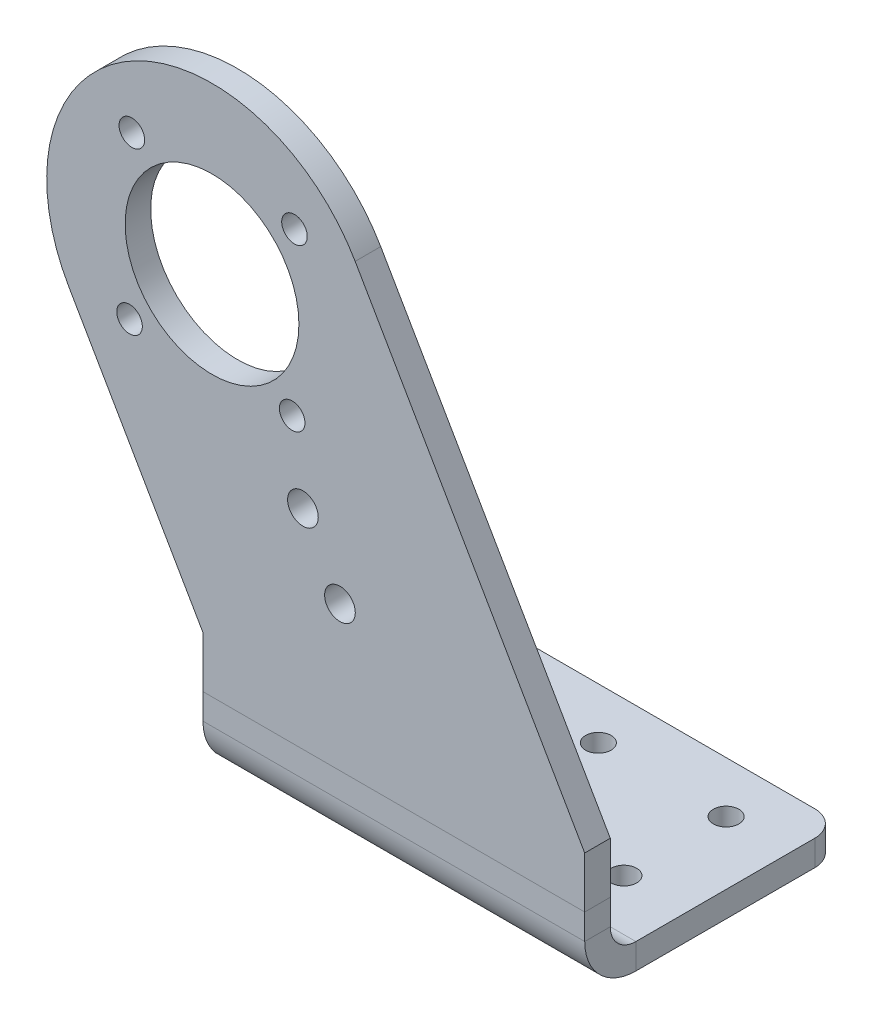
ISO-10303-21;
HEADER;
FILE_DESCRIPTION(('STEP AP214'),'2;1');
FILE_NAME('part.step','',(''),(''),'','','');
FILE_SCHEMA(('AUTOMOTIVE_DESIGN { 1 0 10303 214 1 1 1 1 }'));
ENDSEC;
DATA;
#1=APPLICATION_CONTEXT('core data for automotive mechanical design processes');
#2=APPLICATION_PROTOCOL_DEFINITION('international standard','automotive_design',2000,#1);
#3=PRODUCT_CONTEXT('',#1,'mechanical');
#4=PRODUCT('Part','Part','',(#3));
#5=PRODUCT_RELATED_PRODUCT_CATEGORY('part','',(#4));
#6=PRODUCT_DEFINITION_FORMATION('','',#4);
#7=PRODUCT_DEFINITION_CONTEXT('part definition',#1,'design');
#8=PRODUCT_DEFINITION('design','',#6,#7);
#9=PRODUCT_DEFINITION_SHAPE('','',#8);
#10=(LENGTH_UNIT() NAMED_UNIT(*) SI_UNIT(.MILLI.,.METRE.));
#11=(NAMED_UNIT(*) PLANE_ANGLE_UNIT() SI_UNIT($,.RADIAN.));
#12=(NAMED_UNIT(*) SI_UNIT($,.STERADIAN.) SOLID_ANGLE_UNIT());
#13=UNCERTAINTY_MEASURE_WITH_UNIT(LENGTH_MEASURE(1.E-05),#10,'distance_accuracy_value','');
#14=(GEOMETRIC_REPRESENTATION_CONTEXT(3) GLOBAL_UNCERTAINTY_ASSIGNED_CONTEXT((#13)) GLOBAL_UNIT_ASSIGNED_CONTEXT((#10,
#11,#12)) REPRESENTATION_CONTEXT('',''));
#15=CARTESIAN_POINT('',(0.,0.,0.));
#16=DIRECTION('',(0.,0.,1.));
#17=DIRECTION('',(1.,0.,0.));
#18=AXIS2_PLACEMENT_3D('',#15,#16,#17);
#19=CARTESIAN_POINT('',(51.5597538847893,-65.6863227653069,-5.));
#20=DIRECTION('',(1.,0.,0.));
#21=DIRECTION('',(0.,1.,0.));
#22=AXIS2_PLACEMENT_3D('',#19,#20,#21);
#23=PLANE('',#22);
#24=DIRECTION('',(0.,-1.,0.));
#25=VECTOR('',#24,1.);
#26=CARTESIAN_POINT('',(51.5597538847893,-65.6863227653069,-5.));
#27=LINE('',#26,#25);
#28=CARTESIAN_POINT('',(51.5597538847893,-65.6863227653069,-5.));
#29=VERTEX_POINT('',#28);
#30=CARTESIAN_POINT('',(51.5597538847893,-70.6863227653069,-5.));
#31=VERTEX_POINT('',#30);
#32=EDGE_CURVE('E180',#29,#31,#27,.T.);
#33=ORIENTED_EDGE('',*,*,#32,.F.);
#34=CARTESIAN_POINT('',(51.5597538847893,-60.6863227653069,-5.));
#35=DIRECTION('',(1.,0.,0.));
#36=DIRECTION('',(0.,1.,0.));
#37=AXIS2_PLACEMENT_3D('',#34,#35,#36);
#38=CIRCLE('',#37,5.);
#39=CARTESIAN_POINT('',(51.5597538847893,-60.6863227653069,0.));
#40=VERTEX_POINT('',#39);
#41=EDGE_CURVE('E214',#40,#29,#38,.T.);
#42=ORIENTED_EDGE('',*,*,#41,.F.);
#43=DIRECTION('',(0.,0.,-1.));
#44=VECTOR('',#43,1.);
#45=CARTESIAN_POINT('',(51.5597538847893,-60.6863227653069,5.));
#46=LINE('',#45,#44);
#47=CARTESIAN_POINT('',(51.5597538847893,-60.6863227653069,5.));
#48=VERTEX_POINT('',#47);
#49=EDGE_CURVE('E178',#48,#40,#46,.T.);
#50=ORIENTED_EDGE('',*,*,#49,.F.);
#51=CARTESIAN_POINT('',(51.5597538847893,-60.6863227653069,-5.));
#52=DIRECTION('',(1.,0.,0.));
#53=DIRECTION('',(0.,0.,-1.));
#54=AXIS2_PLACEMENT_3D('',#51,#52,#53);
#55=CIRCLE('',#54,10.);
#56=EDGE_CURVE('E177',#48,#31,#55,.T.);
#57=ORIENTED_EDGE('',*,*,#56,.T.);
#58=EDGE_LOOP('',(#33,#42,#50,#57));
#59=FACE_BOUND('',#58,.T.);
#60=ADVANCED_FACE('F49',(#59),#23,.T.);
#61=CARTESIAN_POINT('',(51.5597538847893,-60.6863227653069,5.));
#62=DIRECTION('',(1.,0.,0.));
#63=DIRECTION('',(0.,1.,0.));
#64=AXIS2_PLACEMENT_3D('',#61,#62,#63);
#65=PLANE('',#64);
#66=DIRECTION('',(0.,0.,-1.));
#67=VECTOR('',#66,1.);
#68=CARTESIAN_POINT('',(51.5597538847893,-70.6863227653069,-5.));
#69=LINE('',#68,#67);
#70=CARTESIAN_POINT('',(51.5597538847893,-70.6863227653069,-40.));
#71=VERTEX_POINT('',#70);
#72=EDGE_CURVE('E208',#31,#71,#69,.T.);
#73=ORIENTED_EDGE('',*,*,#72,.T.);
#74=DIRECTION('',(0.,-1.,0.));
#75=VECTOR('',#74,1.);
#76=CARTESIAN_POINT('',(51.5597538847893,-65.6863227653069,-40.));
#77=LINE('',#76,#75);
#78=CARTESIAN_POINT('',(51.5597538847893,-65.6863227653069,-40.));
#79=VERTEX_POINT('',#78);
#80=EDGE_CURVE('E72',#71,#79,#77,.F.);
#81=ORIENTED_EDGE('',*,*,#80,.T.);
#82=DIRECTION('',(0.,0.,-1.));
#83=VECTOR('',#82,1.);
#84=CARTESIAN_POINT('',(51.5597538847893,-65.6863227653069,-5.));
#85=LINE('',#84,#83);
#86=EDGE_CURVE('E196',#29,#79,#85,.T.);
#87=ORIENTED_EDGE('',*,*,#86,.F.);
#88=ORIENTED_EDGE('',*,*,#32,.T.);
#89=EDGE_LOOP('',(#73,#81,#87,#88));
#90=FACE_BOUND('',#89,.T.);
#91=ADVANCED_FACE('F210',(#90),#65,.T.);
#92=CARTESIAN_POINT('',(-75.3237340684686,-70.686322765307,-5.));
#93=DIRECTION('',(0.,-1.,0.));
#94=DIRECTION('',(1.,0.,0.));
#95=AXIS2_PLACEMENT_3D('',#92,#93,#94);
#96=PLANE('',#95);
#97=CARTESIAN_POINT('',(-10.7812238195632,-70.686322765307,-35.));
#98=DIRECTION('',(0.,1.,0.));
#99=DIRECTION('',(-1.,0.,0.));
#100=AXIS2_PLACEMENT_3D('',#97,#98,#99);
#101=CIRCLE('',#100,2.5);
#102=CARTESIAN_POINT('',(-13.2812238195632,-70.686322765307,-35.));
#103=VERTEX_POINT('',#102);
#104=EDGE_CURVE('E257',#103,#103,#101,.T.);
#105=ORIENTED_EDGE('',*,*,#104,.T.);
#106=EDGE_LOOP('',(#105));
#107=FACE_BOUND('',#106,.T.);
#108=CARTESIAN_POINT('',(-10.7812238195632,-70.686322765307,-15.));
#109=DIRECTION('',(0.,1.,0.));
#110=DIRECTION('',(-1.,0.,0.));
#111=AXIS2_PLACEMENT_3D('',#108,#109,#110);
#112=CIRCLE('',#111,2.5);
#113=CARTESIAN_POINT('',(-13.2812238195632,-70.686322765307,-15.));
#114=VERTEX_POINT('',#113);
#115=EDGE_CURVE('E276',#114,#114,#112,.T.);
#116=ORIENTED_EDGE('',*,*,#115,.T.);
#117=EDGE_LOOP('',(#116));
#118=FACE_BOUND('',#117,.T.);
#119=CARTESIAN_POINT('',(14.2187761804368,-70.686322765307,-15.));
#120=DIRECTION('',(0.,1.,0.));
#121=DIRECTION('',(-1.,0.,0.));
#122=AXIS2_PLACEMENT_3D('',#119,#120,#121);
#123=CIRCLE('',#122,2.5);
#124=CARTESIAN_POINT('',(11.7187761804368,-70.686322765307,-15.));
#125=VERTEX_POINT('',#124);
#126=EDGE_CURVE('E270',#125,#125,#123,.T.);
#127=ORIENTED_EDGE('',*,*,#126,.T.);
#128=EDGE_LOOP('',(#127));
#129=FACE_BOUND('',#128,.T.);
#130=CARTESIAN_POINT('',(39.2187761804368,-70.6863227653069,-15.));
#131=DIRECTION('',(0.,1.,0.));
#132=DIRECTION('',(1.,0.,0.));
#133=AXIS2_PLACEMENT_3D('',#130,#131,#132);
#134=CIRCLE('',#133,2.5);
#135=CARTESIAN_POINT('',(41.7187761804368,-70.6863227653069,-15.));
#136=VERTEX_POINT('',#135);
#137=EDGE_CURVE('E263',#136,#136,#134,.T.);
#138=ORIENTED_EDGE('',*,*,#137,.T.);
#139=EDGE_LOOP('',(#138));
#140=FACE_BOUND('',#139,.T.);
#141=CARTESIAN_POINT('',(39.2187761804368,-70.6863227653069,-35.));
#142=DIRECTION('',(0.,1.,0.));
#143=DIRECTION('',(1.,0.,0.));
#144=AXIS2_PLACEMENT_3D('',#141,#142,#143);
#145=CIRCLE('',#144,2.5);
#146=CARTESIAN_POINT('',(41.7187761804368,-70.6863227653069,-35.));
#147=VERTEX_POINT('',#146);
#148=EDGE_CURVE('E264',#147,#147,#145,.T.);
#149=ORIENTED_EDGE('',*,*,#148,.T.);
#150=EDGE_LOOP('',(#149));
#151=FACE_BOUND('',#150,.T.);
#152=CARTESIAN_POINT('',(14.2187761804368,-70.686322765307,-35.));
#153=DIRECTION('',(0.,1.,0.));
#154=DIRECTION('',(-1.,0.,0.));
#155=AXIS2_PLACEMENT_3D('',#152,#153,#154);
#156=CIRCLE('',#155,2.5);
#157=CARTESIAN_POINT('',(11.7187761804368,-70.686322765307,-35.));
#158=VERTEX_POINT('',#157);
#159=EDGE_CURVE('E158',#158,#158,#156,.T.);
#160=ORIENTED_EDGE('',*,*,#159,.T.);
#161=EDGE_LOOP('',(#160));
#162=FACE_BOUND('',#161,.T.);
#163=DIRECTION('',(1.,0.,0.));
#164=VECTOR('',#163,1.);
#165=CARTESIAN_POINT('',(-75.3237340684685,-70.686322765307,-45.));
#166=LINE('',#165,#164);
#167=CARTESIAN_POINT('',(-18.1222015239158,-70.6863227653069,-45.));
#168=VERTEX_POINT('',#167);
#169=CARTESIAN_POINT('',(46.5597538847893,-70.6863227653069,-45.));
#170=VERTEX_POINT('',#169);
#171=EDGE_CURVE('E174',#168,#170,#166,.T.);
#172=ORIENTED_EDGE('',*,*,#171,.T.);
#173=CARTESIAN_POINT('',(46.5597538847893,-70.6863227653069,-40.));
#174=DIRECTION('',(0.,-1.,0.));
#175=DIRECTION('',(1.,0.,0.));
#176=AXIS2_PLACEMENT_3D('',#173,#174,#175);
#177=CIRCLE('',#176,5.);
#178=EDGE_CURVE('E191',#170,#71,#177,.T.);
#179=ORIENTED_EDGE('',*,*,#178,.T.);
#180=ORIENTED_EDGE('',*,*,#72,.F.);
#181=DIRECTION('',(1.,0.,0.));
#182=VECTOR('',#181,1.);
#183=CARTESIAN_POINT('',(-75.3237340684686,-70.686322765307,-5.));
#184=LINE('',#183,#182);
#185=CARTESIAN_POINT('',(-23.1222015239158,-70.6863227653069,-5.));
#186=VERTEX_POINT('',#185);
#187=EDGE_CURVE('E181',#186,#31,#184,.T.);
#188=ORIENTED_EDGE('',*,*,#187,.F.);
#189=DIRECTION('',(0.,0.,1.));
#190=VECTOR('',#189,1.);
#191=CARTESIAN_POINT('',(-23.1222015239158,-70.6863227653069,-5.));
#192=LINE('',#191,#190);
#193=CARTESIAN_POINT('',(-23.1222015239158,-70.6863227653069,-40.));
#194=VERTEX_POINT('',#193);
#195=EDGE_CURVE('E248',#194,#186,#192,.T.);
#196=ORIENTED_EDGE('',*,*,#195,.F.);
#197=CARTESIAN_POINT('',(-18.1222015239158,-70.6863227653069,-40.));
#198=DIRECTION('',(0.,-1.,0.));
#199=DIRECTION('',(1.,0.,0.));
#200=AXIS2_PLACEMENT_3D('',#197,#198,#199);
#201=CIRCLE('',#200,5.);
#202=EDGE_CURVE('E189',#194,#168,#201,.T.);
#203=ORIENTED_EDGE('',*,*,#202,.T.);
#204=EDGE_LOOP('',(#172,#179,#180,#188,#196,#203));
#205=FACE_BOUND('',#204,.T.);
#206=ADVANCED_FACE('F206',(#107,#118,#129,#140,#151,#162,#205),#96,.T.);
#207=CARTESIAN_POINT('',(-75.3237340684686,-60.686322765307,-5.));
#208=DIRECTION('',(1.,0.,0.));
#209=DIRECTION('',(0.,1.,0.));
#210=AXIS2_PLACEMENT_3D('',#207,#208,#209);
#211=CYLINDRICAL_SURFACE('',#210,10.);
#212=DIRECTION('',(1.,0.,0.));
#213=VECTOR('',#212,1.);
#214=CARTESIAN_POINT('',(-75.3237340684686,-60.686322765307,5.));
#215=LINE('',#214,#213);
#216=CARTESIAN_POINT('',(-23.1222015239158,-60.6863227653069,5.));
#217=VERTEX_POINT('',#216);
#218=EDGE_CURVE('E230',#217,#48,#215,.T.);
#219=ORIENTED_EDGE('',*,*,#218,.F.);
#220=CARTESIAN_POINT('',(-23.1222015239158,-60.6863227653069,-5.));
#221=DIRECTION('',(-1.,0.,0.));
#222=DIRECTION('',(0.,-1.,0.));
#223=AXIS2_PLACEMENT_3D('',#220,#221,#222);
#224=CIRCLE('',#223,10.);
#225=EDGE_CURVE('E135',#186,#217,#224,.T.);
#226=ORIENTED_EDGE('',*,*,#225,.F.);
#227=ORIENTED_EDGE('',*,*,#187,.T.);
#228=ORIENTED_EDGE('',*,*,#56,.F.);
#229=EDGE_LOOP('',(#219,#226,#227,#228));
#230=FACE_BOUND('',#229,.T.);
#231=ADVANCED_FACE('F244',(#230),#211,.T.);
#232=CARTESIAN_POINT('',(-75.3237340684686,-55.686322765307,5.));
#233=DIRECTION('',(0.,0.,1.));
#234=DIRECTION('',(0.,-1.,0.));
#235=AXIS2_PLACEMENT_3D('',#232,#233,#234);
#236=PLANE('',#235);
#237=DIRECTION('',(1.,0.,0.));
#238=VECTOR('',#237,1.);
#239=CARTESIAN_POINT('',(-75.3237340684686,-55.686322765307,5.));
#240=LINE('',#239,#238);
#241=CARTESIAN_POINT('',(-23.1222015239158,-55.6863227653069,5.));
#242=VERTEX_POINT('',#241);
#243=CARTESIAN_POINT('',(51.5597538847893,-55.6863227653069,5.));
#244=VERTEX_POINT('',#243);
#245=EDGE_CURVE('E166',#242,#244,#240,.T.);
#246=ORIENTED_EDGE('',*,*,#245,.F.);
#247=DIRECTION('',(0.,-1.,0.));
#248=VECTOR('',#247,1.);
#249=CARTESIAN_POINT('',(-23.1222015239158,-55.686322765307,5.));
#250=LINE('',#249,#248);
#251=EDGE_CURVE('E139',#217,#242,#250,.F.);
#252=ORIENTED_EDGE('',*,*,#251,.F.);
#253=ORIENTED_EDGE('',*,*,#218,.T.);
#254=DIRECTION('',(0.,-1.,0.));
#255=VECTOR('',#254,1.);
#256=CARTESIAN_POINT('',(51.5597538847893,-55.6863227653069,5.));
#257=LINE('',#256,#255);
#258=EDGE_CURVE('E225',#244,#48,#257,.T.);
#259=ORIENTED_EDGE('',*,*,#258,.F.);
#260=EDGE_LOOP('',(#246,#252,#253,#259));
#261=FACE_BOUND('',#260,.T.);
#262=ADVANCED_FACE('F241',(#261),#236,.T.);
#263=CARTESIAN_POINT('',(-75.3237340684686,-55.686322765307,5.));
#264=DIRECTION('',(0.,-1.,0.));
#265=DIRECTION('',(1.,0.,0.));
#266=AXIS2_PLACEMENT_3D('',#263,#264,#265);
#267=PLANE('',#266);
#268=DIRECTION('',(0.,0.,-1.));
#269=VECTOR('',#268,1.);
#270=CARTESIAN_POINT('',(-23.1222015239158,-55.6863227653069,0.));
#271=LINE('',#270,#269);
#272=CARTESIAN_POINT('',(-23.1222015239158,-55.6863227653069,0.));
#273=VERTEX_POINT('',#272);
#274=EDGE_CURVE('E138',#273,#242,#271,.F.);
#275=ORIENTED_EDGE('',*,*,#274,.T.);
#276=ORIENTED_EDGE('',*,*,#245,.T.);
#277=DIRECTION('',(0.,0.,-1.));
#278=VECTOR('',#277,1.);
#279=CARTESIAN_POINT('',(51.5597538847893,-55.6863227653069,5.));
#280=LINE('',#279,#278);
#281=CARTESIAN_POINT('',(51.5597538847893,-55.6863227653069,0.));
#282=VERTEX_POINT('',#281);
#283=EDGE_CURVE('E222',#244,#282,#280,.T.);
#284=ORIENTED_EDGE('',*,*,#283,.T.);
#285=DIRECTION('',(1.,0.,0.));
#286=VECTOR('',#285,1.);
#287=CARTESIAN_POINT('',(-75.3237340684686,-55.686322765307,0.));
#288=LINE('',#287,#286);
#289=EDGE_CURVE('E164',#273,#282,#288,.T.);
#290=ORIENTED_EDGE('',*,*,#289,.F.);
#291=EDGE_LOOP('',(#275,#276,#284,#290));
#292=FACE_BOUND('',#291,.T.);
#293=ADVANCED_FACE('F235',(#292),#267,.F.);
#294=CARTESIAN_POINT('',(-75.3237340684686,-55.686322765307,0.));
#295=DIRECTION('',(0.,0.,1.));
#296=DIRECTION('',(0.,-1.,0.));
#297=AXIS2_PLACEMENT_3D('',#294,#295,#296);
#298=PLANE('',#297);
#299=DIRECTION('',(0.,1.,0.));
#300=VECTOR('',#299,1.);
#301=CARTESIAN_POINT('',(-23.1222015239158,-55.6863227653071,0.));
#302=LINE('',#301,#300);
#303=CARTESIAN_POINT('',(-23.1222015239158,-60.6863227653069,0.));
#304=VERTEX_POINT('',#303);
#305=EDGE_CURVE('E142',#304,#273,#302,.T.);
#306=ORIENTED_EDGE('',*,*,#305,.T.);
#307=ORIENTED_EDGE('',*,*,#289,.T.);
#308=DIRECTION('',(0.,-1.,0.));
#309=VECTOR('',#308,1.);
#310=CARTESIAN_POINT('',(51.5597538847893,-55.6863227653069,0.));
#311=LINE('',#310,#309);
#312=EDGE_CURVE('E162',#282,#40,#311,.T.);
#313=ORIENTED_EDGE('',*,*,#312,.T.);
#314=DIRECTION('',(1.,0.,0.));
#315=VECTOR('',#314,1.);
#316=CARTESIAN_POINT('',(-75.3237340684686,-60.686322765307,0.));
#317=LINE('',#316,#315);
#318=EDGE_CURVE('E154',#304,#40,#317,.T.);
#319=ORIENTED_EDGE('',*,*,#318,.F.);
#320=EDGE_LOOP('',(#306,#307,#313,#319));
#321=FACE_BOUND('',#320,.T.);
#322=ADVANCED_FACE('F160',(#321),#298,.F.);
#323=CARTESIAN_POINT('',(-75.3237340684686,-60.686322765307,-5.));
#324=DIRECTION('',(1.,0.,0.));
#325=DIRECTION('',(0.,1.,0.));
#326=AXIS2_PLACEMENT_3D('',#323,#324,#325);
#327=CYLINDRICAL_SURFACE('',#326,5.);
#328=CARTESIAN_POINT('',(-23.1222015239158,-60.6863227653069,-5.));
#329=DIRECTION('',(1.,0.,0.));
#330=DIRECTION('',(0.,1.,0.));
#331=AXIS2_PLACEMENT_3D('',#328,#329,#330);
#332=CIRCLE('',#331,5.);
#333=CARTESIAN_POINT('',(-23.1222015239158,-65.6863227653069,-5.));
#334=VERTEX_POINT('',#333);
#335=EDGE_CURVE('E132',#334,#304,#332,.F.);
#336=ORIENTED_EDGE('',*,*,#335,.T.);
#337=ORIENTED_EDGE('',*,*,#318,.T.);
#338=ORIENTED_EDGE('',*,*,#41,.T.);
#339=DIRECTION('',(1.,0.,0.));
#340=VECTOR('',#339,1.);
#341=CARTESIAN_POINT('',(-75.3237340684686,-65.686322765307,-5.));
#342=LINE('',#341,#340);
#343=EDGE_CURVE('E157',#334,#29,#342,.T.);
#344=ORIENTED_EDGE('',*,*,#343,.F.);
#345=EDGE_LOOP('',(#336,#337,#338,#344));
#346=FACE_BOUND('',#345,.T.);
#347=ADVANCED_FACE('F152',(#346),#327,.F.);
#348=CARTESIAN_POINT('',(-75.3237340684685,-65.686322765307,-5.));
#349=DIRECTION('',(0.,-1.,0.));
#350=DIRECTION('',(1.,0.,0.));
#351=AXIS2_PLACEMENT_3D('',#348,#349,#350);
#352=PLANE('',#351);
#353=CARTESIAN_POINT('',(-10.7812238195632,-65.6863227653069,-35.));
#354=DIRECTION('',(0.,1.,0.));
#355=DIRECTION('',(-1.,0.,0.));
#356=AXIS2_PLACEMENT_3D('',#353,#354,#355);
#357=CIRCLE('',#356,2.5);
#358=CARTESIAN_POINT('',(-13.2812238195632,-65.6863227653069,-35.));
#359=VERTEX_POINT('',#358);
#360=EDGE_CURVE('E279',#359,#359,#357,.T.);
#361=ORIENTED_EDGE('',*,*,#360,.F.);
#362=EDGE_LOOP('',(#361));
#363=FACE_BOUND('',#362,.T.);
#364=CARTESIAN_POINT('',(-10.7812238195632,-65.6863227653069,-15.));
#365=DIRECTION('',(0.,1.,0.));
#366=DIRECTION('',(-1.,0.,0.));
#367=AXIS2_PLACEMENT_3D('',#364,#365,#366);
#368=CIRCLE('',#367,2.5);
#369=CARTESIAN_POINT('',(-13.2812238195632,-65.6863227653069,-15.));
#370=VERTEX_POINT('',#369);
#371=EDGE_CURVE('E273',#370,#370,#368,.T.);
#372=ORIENTED_EDGE('',*,*,#371,.F.);
#373=EDGE_LOOP('',(#372));
#374=FACE_BOUND('',#373,.T.);
#375=CARTESIAN_POINT('',(14.2187761804368,-65.6863227653069,-15.));
#376=DIRECTION('',(0.,1.,0.));
#377=DIRECTION('',(-1.,0.,0.));
#378=AXIS2_PLACEMENT_3D('',#375,#376,#377);
#379=CIRCLE('',#378,2.5);
#380=CARTESIAN_POINT('',(11.7187761804368,-65.6863227653069,-15.));
#381=VERTEX_POINT('',#380);
#382=EDGE_CURVE('E267',#381,#381,#379,.T.);
#383=ORIENTED_EDGE('',*,*,#382,.F.);
#384=EDGE_LOOP('',(#383));
#385=FACE_BOUND('',#384,.T.);
#386=CARTESIAN_POINT('',(39.2187761804368,-65.6863227653069,-15.));
#387=DIRECTION('',(0.,1.,0.));
#388=DIRECTION('',(1.,0.,0.));
#389=AXIS2_PLACEMENT_3D('',#386,#387,#388);
#390=CIRCLE('',#389,2.5);
#391=CARTESIAN_POINT('',(41.7187761804368,-65.6863227653069,-15.));
#392=VERTEX_POINT('',#391);
#393=EDGE_CURVE('E260',#392,#392,#390,.T.);
#394=ORIENTED_EDGE('',*,*,#393,.F.);
#395=EDGE_LOOP('',(#394));
#396=FACE_BOUND('',#395,.T.);
#397=CARTESIAN_POINT('',(39.2187761804368,-65.6863227653069,-35.));
#398=DIRECTION('',(0.,1.,0.));
#399=DIRECTION('',(1.,0.,0.));
#400=AXIS2_PLACEMENT_3D('',#397,#398,#399);
#401=CIRCLE('',#400,2.5);
#402=CARTESIAN_POINT('',(41.7187761804368,-65.6863227653069,-35.));
#403=VERTEX_POINT('',#402);
#404=EDGE_CURVE('E284',#403,#403,#401,.T.);
#405=ORIENTED_EDGE('',*,*,#404,.F.);
#406=EDGE_LOOP('',(#405));
#407=FACE_BOUND('',#406,.T.);
#408=CARTESIAN_POINT('',(14.2187761804368,-65.6863227653069,-35.));
#409=DIRECTION('',(0.,1.,0.));
#410=DIRECTION('',(-1.,0.,0.));
#411=AXIS2_PLACEMENT_3D('',#408,#409,#410);
#412=CIRCLE('',#411,2.5);
#413=CARTESIAN_POINT('',(11.7187761804368,-65.6863227653069,-35.));
#414=VERTEX_POINT('',#413);
#415=EDGE_CURVE('E254',#414,#414,#412,.T.);
#416=ORIENTED_EDGE('',*,*,#415,.F.);
#417=EDGE_LOOP('',(#416));
#418=FACE_BOUND('',#417,.T.);
#419=ORIENTED_EDGE('',*,*,#86,.T.);
#420=CARTESIAN_POINT('',(46.5597538847893,-65.6863227653069,-40.));
#421=DIRECTION('',(0.,-1.,0.));
#422=DIRECTION('',(1.,0.,0.));
#423=AXIS2_PLACEMENT_3D('',#420,#421,#422);
#424=CIRCLE('',#423,5.);
#425=CARTESIAN_POINT('',(46.5597538847893,-65.6863227653069,-45.));
#426=VERTEX_POINT('',#425);
#427=EDGE_CURVE('E57',#79,#426,#424,.F.);
#428=ORIENTED_EDGE('',*,*,#427,.T.);
#429=DIRECTION('',(1.,0.,0.));
#430=VECTOR('',#429,1.);
#431=CARTESIAN_POINT('',(-75.3237340684685,-65.686322765307,-45.));
#432=LINE('',#431,#430);
#433=CARTESIAN_POINT('',(-18.1222015239158,-65.6863227653069,-45.));
#434=VERTEX_POINT('',#433);
#435=EDGE_CURVE('E168',#434,#426,#432,.T.);
#436=ORIENTED_EDGE('',*,*,#435,.F.);
#437=CARTESIAN_POINT('',(-18.1222015239158,-65.6863227653069,-40.));
#438=DIRECTION('',(0.,-1.,0.));
#439=DIRECTION('',(1.,0.,0.));
#440=AXIS2_PLACEMENT_3D('',#437,#438,#439);
#441=CIRCLE('',#440,5.);
#442=CARTESIAN_POINT('',(-23.1222015239158,-65.6863227653069,-40.));
#443=VERTEX_POINT('',#442);
#444=EDGE_CURVE('E64',#434,#443,#441,.F.);
#445=ORIENTED_EDGE('',*,*,#444,.T.);
#446=DIRECTION('',(0.,0.,1.));
#447=VECTOR('',#446,1.);
#448=CARTESIAN_POINT('',(-23.1222015239158,-65.6863227653069,-5.));
#449=LINE('',#448,#447);
#450=EDGE_CURVE('E216',#443,#334,#449,.T.);
#451=ORIENTED_EDGE('',*,*,#450,.T.);
#452=ORIENTED_EDGE('',*,*,#343,.T.);
#453=EDGE_LOOP('',(#419,#428,#436,#445,#451,#452));
#454=FACE_BOUND('',#453,.T.);
#455=ADVANCED_FACE('F195',(#363,#374,#385,#396,#407,#418,#454),#352,.F.);
#456=CARTESIAN_POINT('',(-75.3237340684685,-65.686322765307,-45.));
#457=DIRECTION('',(0.,0.,1.));
#458=DIRECTION('',(1.,0.,0.));
#459=AXIS2_PLACEMENT_3D('',#456,#457,#458);
#460=PLANE('',#459);
#461=ORIENTED_EDGE('',*,*,#435,.T.);
#462=DIRECTION('',(0.,-1.,0.));
#463=VECTOR('',#462,1.);
#464=CARTESIAN_POINT('',(46.5597538847893,-70.6863227653069,-45.));
#465=LINE('',#464,#463);
#466=EDGE_CURVE('E186',#426,#170,#465,.T.);
#467=ORIENTED_EDGE('',*,*,#466,.T.);
#468=ORIENTED_EDGE('',*,*,#171,.F.);
#469=DIRECTION('',(0.,-1.,0.));
#470=VECTOR('',#469,1.);
#471=CARTESIAN_POINT('',(-18.1222015239158,-65.6863227653069,-45.));
#472=LINE('',#471,#470);
#473=EDGE_CURVE('E183',#168,#434,#472,.F.);
#474=ORIENTED_EDGE('',*,*,#473,.T.);
#475=EDGE_LOOP('',(#461,#467,#468,#474));
#476=FACE_BOUND('',#475,.T.);
#477=ADVANCED_FACE('F200',(#476),#460,.F.);
#478=CARTESIAN_POINT('',(51.5597538847893,-60.6863227653069,-5.));
#479=DIRECTION('',(1.,0.,0.));
#480=DIRECTION('',(0.,0.,-1.));
#481=AXIS2_PLACEMENT_3D('',#478,#479,#480);
#482=PLANE('',#481);
#483=ORIENTED_EDGE('',*,*,#258,.T.);
#484=ORIENTED_EDGE('',*,*,#49,.T.);
#485=ORIENTED_EDGE('',*,*,#312,.F.);
#486=ORIENTED_EDGE('',*,*,#283,.F.);
#487=EDGE_LOOP('',(#483,#484,#485,#486));
#488=FACE_BOUND('',#487,.T.);
#489=ADVANCED_FACE('F239',(#488),#482,.T.);
#490=CARTESIAN_POINT('',(-23.1222015239158,-70.6863227653069,-5.));
#491=DIRECTION('',(1.,0.,0.));
#492=DIRECTION('',(0.,0.,1.));
#493=AXIS2_PLACEMENT_3D('',#490,#491,#492);
#494=PLANE('',#493);
#495=ORIENTED_EDGE('',*,*,#450,.F.);
#496=DIRECTION('',(0.,1.,0.));
#497=VECTOR('',#496,1.);
#498=CARTESIAN_POINT('',(-23.1222015239158,-70.6863227653069,-40.));
#499=LINE('',#498,#497);
#500=EDGE_CURVE('E12',#443,#194,#499,.F.);
#501=ORIENTED_EDGE('',*,*,#500,.T.);
#502=ORIENTED_EDGE('',*,*,#195,.T.);
#503=DIRECTION('',(0.,-1.,0.));
#504=VECTOR('',#503,1.);
#505=CARTESIAN_POINT('',(-23.1222015239158,-70.6863227653069,-5.));
#506=LINE('',#505,#504);
#507=EDGE_CURVE('E212',#186,#334,#506,.F.);
#508=ORIENTED_EDGE('',*,*,#507,.T.);
#509=EDGE_LOOP('',(#495,#501,#502,#508));
#510=FACE_BOUND('',#509,.T.);
#511=ADVANCED_FACE('F372',(#510),#494,.F.);
#512=CARTESIAN_POINT('',(-23.1222015239158,-55.6863227653071,0.));
#513=DIRECTION('',(1.,0.,0.));
#514=DIRECTION('',(0.,1.,0.));
#515=AXIS2_PLACEMENT_3D('',#512,#513,#514);
#516=PLANE('',#515);
#517=ORIENTED_EDGE('',*,*,#274,.F.);
#518=ORIENTED_EDGE('',*,*,#305,.F.);
#519=DIRECTION('',(0.,0.,-1.));
#520=VECTOR('',#519,1.);
#521=CARTESIAN_POINT('',(-23.1222015239158,-60.6863227653069,0.));
#522=LINE('',#521,#520);
#523=EDGE_CURVE('E127',#304,#217,#522,.F.);
#524=ORIENTED_EDGE('',*,*,#523,.T.);
#525=ORIENTED_EDGE('',*,*,#251,.T.);
#526=EDGE_LOOP('',(#517,#518,#524,#525));
#527=FACE_BOUND('',#526,.T.);
#528=ADVANCED_FACE('F143',(#527),#516,.F.);
#529=CARTESIAN_POINT('',(-23.1222015239158,-60.6863227653069,-5.));
#530=DIRECTION('',(-1.,0.,0.));
#531=DIRECTION('',(0.,-1.,0.));
#532=AXIS2_PLACEMENT_3D('',#529,#530,#531);
#533=PLANE('',#532);
#534=ORIENTED_EDGE('',*,*,#225,.T.);
#535=ORIENTED_EDGE('',*,*,#523,.F.);
#536=ORIENTED_EDGE('',*,*,#335,.F.);
#537=ORIENTED_EDGE('',*,*,#507,.F.);
#538=EDGE_LOOP('',(#534,#535,#536,#537));
#539=FACE_BOUND('',#538,.T.);
#540=ADVANCED_FACE('F129',(#539),#533,.T.);
#541=CARTESIAN_POINT('',(14.2187761804368,-70.686322765307,-35.));
#542=DIRECTION('',(0.,1.,0.));
#543=DIRECTION('',(-1.,0.,0.));
#544=AXIS2_PLACEMENT_3D('',#541,#542,#543);
#545=CYLINDRICAL_SURFACE('',#544,2.5);
#546=ORIENTED_EDGE('',*,*,#159,.F.);
#547=EDGE_LOOP('',(#546));
#548=FACE_BOUND('',#547,.T.);
#549=ORIENTED_EDGE('',*,*,#415,.T.);
#550=EDGE_LOOP('',(#549));
#551=FACE_BOUND('',#550,.T.);
#552=ADVANCED_FACE('F296',(#548,#551),#545,.F.);
#553=CARTESIAN_POINT('',(39.2187761804368,-70.6863227653069,-35.));
#554=DIRECTION('',(0.,1.,0.));
#555=DIRECTION('',(-1.,0.,0.));
#556=AXIS2_PLACEMENT_3D('',#553,#554,#555);
#557=CYLINDRICAL_SURFACE('',#556,2.5);
#558=ORIENTED_EDGE('',*,*,#148,.F.);
#559=EDGE_LOOP('',(#558));
#560=FACE_BOUND('',#559,.T.);
#561=ORIENTED_EDGE('',*,*,#404,.T.);
#562=EDGE_LOOP('',(#561));
#563=FACE_BOUND('',#562,.T.);
#564=ADVANCED_FACE('F292',(#560,#563),#557,.F.);
#565=CARTESIAN_POINT('',(39.2187761804368,-70.6863227653069,-15.));
#566=DIRECTION('',(0.,1.,0.));
#567=DIRECTION('',(-1.,0.,0.));
#568=AXIS2_PLACEMENT_3D('',#565,#566,#567);
#569=CYLINDRICAL_SURFACE('',#568,2.5);
#570=ORIENTED_EDGE('',*,*,#137,.F.);
#571=EDGE_LOOP('',(#570));
#572=FACE_BOUND('',#571,.T.);
#573=ORIENTED_EDGE('',*,*,#393,.T.);
#574=EDGE_LOOP('',(#573));
#575=FACE_BOUND('',#574,.T.);
#576=ADVANCED_FACE('F295',(#572,#575),#569,.F.);
#577=CARTESIAN_POINT('',(14.2187761804368,-70.686322765307,-15.));
#578=DIRECTION('',(0.,1.,0.));
#579=DIRECTION('',(-1.,0.,0.));
#580=AXIS2_PLACEMENT_3D('',#577,#578,#579);
#581=CYLINDRICAL_SURFACE('',#580,2.5);
#582=ORIENTED_EDGE('',*,*,#126,.F.);
#583=EDGE_LOOP('',(#582));
#584=FACE_BOUND('',#583,.T.);
#585=ORIENTED_EDGE('',*,*,#382,.T.);
#586=EDGE_LOOP('',(#585));
#587=FACE_BOUND('',#586,.T.);
#588=ADVANCED_FACE('F335',(#584,#587),#581,.F.);
#589=CARTESIAN_POINT('',(-10.7812238195632,-70.686322765307,-15.));
#590=DIRECTION('',(0.,1.,0.));
#591=DIRECTION('',(-1.,0.,0.));
#592=AXIS2_PLACEMENT_3D('',#589,#590,#591);
#593=CYLINDRICAL_SURFACE('',#592,2.5);
#594=ORIENTED_EDGE('',*,*,#115,.F.);
#595=EDGE_LOOP('',(#594));
#596=FACE_BOUND('',#595,.T.);
#597=ORIENTED_EDGE('',*,*,#371,.T.);
#598=EDGE_LOOP('',(#597));
#599=FACE_BOUND('',#598,.T.);
#600=ADVANCED_FACE('F329',(#596,#599),#593,.F.);
#601=CARTESIAN_POINT('',(-10.7812238195632,-70.686322765307,-35.));
#602=DIRECTION('',(0.,1.,0.));
#603=DIRECTION('',(-1.,0.,0.));
#604=AXIS2_PLACEMENT_3D('',#601,#602,#603);
#605=CYLINDRICAL_SURFACE('',#604,2.5);
#606=ORIENTED_EDGE('',*,*,#104,.F.);
#607=EDGE_LOOP('',(#606));
#608=FACE_BOUND('',#607,.T.);
#609=ORIENTED_EDGE('',*,*,#360,.T.);
#610=EDGE_LOOP('',(#609));
#611=FACE_BOUND('',#610,.T.);
#612=ADVANCED_FACE('F323',(#608,#611),#605,.F.);
#613=CARTESIAN_POINT('',(46.5597538847893,-65.6863227653069,-40.));
#614=DIRECTION('',(0.,1.,0.));
#615=DIRECTION('',(-1.,0.,0.));
#616=AXIS2_PLACEMENT_3D('',#613,#614,#615);
#617=CYLINDRICAL_SURFACE('',#616,5.);
#618=ORIENTED_EDGE('',*,*,#427,.F.);
#619=ORIENTED_EDGE('',*,*,#80,.F.);
#620=ORIENTED_EDGE('',*,*,#178,.F.);
#621=ORIENTED_EDGE('',*,*,#466,.F.);
#622=EDGE_LOOP('',(#618,#619,#620,#621));
#623=FACE_BOUND('',#622,.T.);
#624=ADVANCED_FACE('F203',(#623),#617,.T.);
#625=CARTESIAN_POINT('',(-18.1222015239158,-65.6863227653069,-40.));
#626=DIRECTION('',(0.,1.,0.));
#627=DIRECTION('',(-1.,0.,0.));
#628=AXIS2_PLACEMENT_3D('',#625,#626,#627);
#629=CYLINDRICAL_SURFACE('',#628,5.);
#630=ORIENTED_EDGE('',*,*,#202,.F.);
#631=ORIENTED_EDGE('',*,*,#500,.F.);
#632=ORIENTED_EDGE('',*,*,#444,.F.);
#633=ORIENTED_EDGE('',*,*,#473,.F.);
#634=EDGE_LOOP('',(#630,#631,#632,#633));
#635=FACE_BOUND('',#634,.T.);
#636=ADVANCED_FACE('F51',(#635),#629,.T.);
#637=CLOSED_SHELL('',(#60,#91,#206,#231,#262,#293,#322,#347,#455,#477,#489,#511,#528,#540,#552,
#564,#576,#588,#600,#612,#624,#636));
#638=MANIFOLD_SOLID_BREP('B2',#637);
#639=CARTESIAN_POINT('',(51.5597538847893,0.,5.));
#640=DIRECTION('',(1.,0.,0.));
#641=DIRECTION('',(0.,1.,0.));
#642=AXIS2_PLACEMENT_3D('',#639,#640,#641);
#643=PLANE('',#642);
#644=DIRECTION('',(0.,-1.,0.));
#645=VECTOR('',#644,1.);
#646=CARTESIAN_POINT('',(51.5597538847893,0.,0.));
#647=LINE('',#646,#645);
#648=CARTESIAN_POINT('',(51.5597538847893,-45.6863227653068,0.));
#649=VERTEX_POINT('',#648);
#650=CARTESIAN_POINT('',(51.5597538847893,-55.6863227653069,0.));
#651=VERTEX_POINT('',#650);
#652=EDGE_CURVE('E642',#649,#651,#647,.T.);
#653=ORIENTED_EDGE('',*,*,#652,.F.);
#654=DIRECTION('',(0.,0.,-1.));
#655=VECTOR('',#654,1.);
#656=CARTESIAN_POINT('',(51.5597538847893,-45.6863227653068,5.));
#657=LINE('',#656,#655);
#658=CARTESIAN_POINT('',(51.5597538847893,-45.6863227653068,5.));
#659=VERTEX_POINT('',#658);
#660=EDGE_CURVE('E47',#659,#649,#657,.T.);
#661=ORIENTED_EDGE('',*,*,#660,.F.);
#662=DIRECTION('',(0.,-1.,0.));
#663=VECTOR('',#662,1.);
#664=CARTESIAN_POINT('',(51.5597538847893,0.,5.));
#665=LINE('',#664,#663);
#666=CARTESIAN_POINT('',(51.5597538847893,-55.6863227653069,5.));
#667=VERTEX_POINT('',#666);
#668=EDGE_CURVE('E675',#659,#667,#665,.T.);
#669=ORIENTED_EDGE('',*,*,#668,.T.);
#670=DIRECTION('',(0.,0.,-1.));
#671=VECTOR('',#670,1.);
#672=CARTESIAN_POINT('',(51.5597538847893,-55.6863227653069,5.));
#673=LINE('',#672,#671);
#674=EDGE_CURVE('E584',#667,#651,#673,.T.);
#675=ORIENTED_EDGE('',*,*,#674,.T.);
#676=EDGE_LOOP('',(#653,#661,#669,#675));
#677=FACE_BOUND('',#676,.T.);
#678=ADVANCED_FACE('F539',(#677),#643,.T.);
#679=CARTESIAN_POINT('',(18.8870573534665,10.9044476472238,5.));
#680=DIRECTION('',(0.866025403784439,0.5,0.));
#681=DIRECTION('',(-0.5,0.866025403784439,0.));
#682=AXIS2_PLACEMENT_3D('',#679,#680,#681);
#683=PLANE('',#682);
#684=DIRECTION('',(0.5,-0.866025403784439,0.));
#685=VECTOR('',#684,1.);
#686=CARTESIAN_POINT('',(18.8870573534665,10.9044476472238,0.));
#687=LINE('',#686,#685);
#688=CARTESIAN_POINT('',(6.65140441207909,32.0972202054862,0.));
#689=VERTEX_POINT('',#688);
#690=EDGE_CURVE('E645',#689,#649,#687,.T.);
#691=ORIENTED_EDGE('',*,*,#690,.F.);
#692=DIRECTION('',(0.,0.,-1.));
#693=VECTOR('',#692,1.);
#694=CARTESIAN_POINT('',(6.65140441207909,32.0972202054862,5.));
#695=LINE('',#694,#693);
#696=CARTESIAN_POINT('',(6.65140441207909,32.0972202054862,5.));
#697=VERTEX_POINT('',#696);
#698=EDGE_CURVE('E547',#697,#689,#695,.T.);
#699=ORIENTED_EDGE('',*,*,#698,.F.);
#700=DIRECTION('',(0.5,-0.866025403784439,0.));
#701=VECTOR('',#700,1.);
#702=CARTESIAN_POINT('',(18.8870573534665,10.9044476472238,5.));
#703=LINE('',#702,#701);
#704=EDGE_CURVE('E688',#697,#659,#703,.T.);
#705=ORIENTED_EDGE('',*,*,#704,.T.);
#706=ORIENTED_EDGE('',*,*,#660,.T.);
#707=EDGE_LOOP('',(#691,#699,#705,#706));
#708=FACE_BOUND('',#707,.T.);
#709=ADVANCED_FACE('F687',(#708),#683,.T.);
#710=CARTESIAN_POINT('',(-21.3543288661853,15.9281025584274,5.));
#711=DIRECTION('',(0.,0.,-1.));
#712=DIRECTION('',(-1.,0.,0.));
#713=AXIS2_PLACEMENT_3D('',#710,#711,#712);
#714=CYLINDRICAL_SURFACE('',#713,32.3382352941176);
#715=CARTESIAN_POINT('',(-21.3543288661853,15.9281025584274,0.));
#716=DIRECTION('',(0.,0.,1.));
#717=DIRECTION('',(1.,0.,0.));
#718=AXIS2_PLACEMENT_3D('',#715,#716,#717);
#719=CIRCLE('',#718,32.3382352941176);
#720=CARTESIAN_POINT('',(-49.3600621444497,-0.24101508863144,0.));
#721=VERTEX_POINT('',#720);
#722=EDGE_CURVE('E648',#689,#721,#719,.T.);
#723=ORIENTED_EDGE('',*,*,#722,.T.);
#724=DIRECTION('',(0.,0.,-1.));
#725=VECTOR('',#724,1.);
#726=CARTESIAN_POINT('',(-49.3600621444497,-0.24101508863144,5.));
#727=LINE('',#726,#725);
#728=CARTESIAN_POINT('',(-49.3600621444497,-0.24101508863144,5.));
#729=VERTEX_POINT('',#728);
#730=EDGE_CURVE('E613',#729,#721,#727,.T.);
#731=ORIENTED_EDGE('',*,*,#730,.F.);
#732=CARTESIAN_POINT('',(-21.3543288661853,15.9281025584274,5.));
#733=DIRECTION('',(0.,0.,1.));
#734=DIRECTION('',(1.,0.,0.));
#735=AXIS2_PLACEMENT_3D('',#732,#733,#734);
#736=CIRCLE('',#735,32.3382352941176);
#737=EDGE_CURVE('E604',#697,#729,#736,.T.);
#738=ORIENTED_EDGE('',*,*,#737,.F.);
#739=ORIENTED_EDGE('',*,*,#698,.T.);
#740=EDGE_LOOP('',(#723,#731,#738,#739));
#741=FACE_BOUND('',#740,.T.);
#742=ADVANCED_FACE('F680',(#741),#714,.T.);
#743=CARTESIAN_POINT('',(-37.1244092030624,-21.4337876468939,5.));
#744=DIRECTION('',(0.866025403784438,0.5,0.));
#745=DIRECTION('',(-0.5,0.866025403784438,0.));
#746=AXIS2_PLACEMENT_3D('',#743,#744,#745);
#747=PLANE('',#746);
#748=DIRECTION('',(0.5,-0.866025403784438,0.));
#749=VECTOR('',#748,1.);
#750=CARTESIAN_POINT('',(-37.1244092030624,-21.4337876468939,0.));
#751=LINE('',#750,#749);
#752=CARTESIAN_POINT('',(-23.1222015239158,-45.6863227653069,0.));
#753=VERTEX_POINT('',#752);
#754=EDGE_CURVE('E612',#721,#753,#751,.T.);
#755=ORIENTED_EDGE('',*,*,#754,.T.);
#756=DIRECTION('',(0.,0.,-1.));
#757=VECTOR('',#756,1.);
#758=CARTESIAN_POINT('',(-23.1222015239158,-45.6863227653069,5.));
#759=LINE('',#758,#757);
#760=CARTESIAN_POINT('',(-23.1222015239158,-45.6863227653069,5.));
#761=VERTEX_POINT('',#760);
#762=EDGE_CURVE('E609',#761,#753,#759,.T.);
#763=ORIENTED_EDGE('',*,*,#762,.F.);
#764=DIRECTION('',(0.5,-0.866025403784438,0.));
#765=VECTOR('',#764,1.);
#766=CARTESIAN_POINT('',(-37.1244092030624,-21.4337876468939,5.));
#767=LINE('',#766,#765);
#768=EDGE_CURVE('E596',#729,#761,#767,.T.);
#769=ORIENTED_EDGE('',*,*,#768,.F.);
#770=ORIENTED_EDGE('',*,*,#730,.T.);
#771=EDGE_LOOP('',(#755,#763,#769,#770));
#772=FACE_BOUND('',#771,.T.);
#773=ADVANCED_FACE('F610',(#772),#747,.F.);
#774=CARTESIAN_POINT('',(-23.1222015239157,0.,5.));
#775=DIRECTION('',(1.,0.,0.));
#776=DIRECTION('',(0.,1.,0.));
#777=AXIS2_PLACEMENT_3D('',#774,#775,#776);
#778=PLANE('',#777);
#779=DIRECTION('',(0.,-1.,0.));
#780=VECTOR('',#779,1.);
#781=CARTESIAN_POINT('',(-23.1222015239157,0.,0.));
#782=LINE('',#781,#780);
#783=CARTESIAN_POINT('',(-23.1222015239158,-55.6863227653069,0.));
#784=VERTEX_POINT('',#783);
#785=EDGE_CURVE('E577',#753,#784,#782,.T.);
#786=ORIENTED_EDGE('',*,*,#785,.T.);
#787=DIRECTION('',(0.,0.,-1.));
#788=VECTOR('',#787,1.);
#789=CARTESIAN_POINT('',(-23.1222015239158,-55.6863227653069,5.));
#790=LINE('',#789,#788);
#791=CARTESIAN_POINT('',(-23.1222015239158,-55.6863227653069,5.));
#792=VERTEX_POINT('',#791);
#793=EDGE_CURVE('E614',#792,#784,#790,.T.);
#794=ORIENTED_EDGE('',*,*,#793,.F.);
#795=DIRECTION('',(0.,-1.,0.));
#796=VECTOR('',#795,1.);
#797=CARTESIAN_POINT('',(-23.1222015239157,0.,5.));
#798=LINE('',#797,#796);
#799=EDGE_CURVE('E601',#761,#792,#798,.T.);
#800=ORIENTED_EDGE('',*,*,#799,.F.);
#801=ORIENTED_EDGE('',*,*,#762,.T.);
#802=EDGE_LOOP('',(#786,#794,#800,#801));
#803=FACE_BOUND('',#802,.T.);
#804=ADVANCED_FACE('F616',(#803),#778,.F.);
#805=CARTESIAN_POINT('',(-37.0381908614087,32.060878913252,5.));
#806=DIRECTION('',(0.,0.,-1.));
#807=DIRECTION('',(-1.,0.,0.));
#808=AXIS2_PLACEMENT_3D('',#805,#806,#807);
#809=CYLINDRICAL_SURFACE('',#808,2.5);
#810=CARTESIAN_POINT('',(-37.0381908614087,32.060878913252,5.));
#811=DIRECTION('',(0.,0.,1.));
#812=DIRECTION('',(1.,0.,0.));
#813=AXIS2_PLACEMENT_3D('',#810,#811,#812);
#814=CIRCLE('',#813,2.5);
#815=CARTESIAN_POINT('',(-34.5381908614087,32.060878913252,5.));
#816=VERTEX_POINT('',#815);
#817=EDGE_CURVE('E636',#816,#816,#814,.T.);
#818=ORIENTED_EDGE('',*,*,#817,.T.);
#819=EDGE_LOOP('',(#818));
#820=FACE_BOUND('',#819,.T.);
#821=CARTESIAN_POINT('',(-37.0381908614087,32.060878913252,0.));
#822=DIRECTION('',(0.,0.,1.));
#823=DIRECTION('',(1.,0.,0.));
#824=AXIS2_PLACEMENT_3D('',#821,#822,#823);
#825=CIRCLE('',#824,2.5);
#826=CARTESIAN_POINT('',(-34.5381908614087,32.060878913252,0.));
#827=VERTEX_POINT('',#826);
#828=EDGE_CURVE('E669',#827,#827,#825,.T.);
#829=ORIENTED_EDGE('',*,*,#828,.F.);
#830=EDGE_LOOP('',(#829));
#831=FACE_BOUND('',#830,.T.);
#832=ADVANCED_FACE('F719',(#820,#831),#809,.F.);
#833=CARTESIAN_POINT('',(-3.56777634287428,-14.8791101034397,5.));
#834=DIRECTION('',(0.,0.,-1.));
#835=DIRECTION('',(-1.,0.,0.));
#836=AXIS2_PLACEMENT_3D('',#833,#834,#835);
#837=CYLINDRICAL_SURFACE('',#836,3.);
#838=CARTESIAN_POINT('',(-3.56777634287428,-14.8791101034397,5.));
#839=DIRECTION('',(0.,0.,1.));
#840=DIRECTION('',(1.,0.,0.));
#841=AXIS2_PLACEMENT_3D('',#838,#839,#840);
#842=CIRCLE('',#841,3.);
#843=CARTESIAN_POINT('',(-0.567776342874282,-14.8791101034397,5.));
#844=VERTEX_POINT('',#843);
#845=EDGE_CURVE('E633',#844,#844,#842,.T.);
#846=ORIENTED_EDGE('',*,*,#845,.T.);
#847=EDGE_LOOP('',(#846));
#848=FACE_BOUND('',#847,.T.);
#849=CARTESIAN_POINT('',(-3.56777634287428,-14.8791101034397,0.));
#850=DIRECTION('',(0.,0.,1.));
#851=DIRECTION('',(1.,0.,0.));
#852=AXIS2_PLACEMENT_3D('',#849,#850,#851);
#853=CIRCLE('',#852,3.);
#854=CARTESIAN_POINT('',(-0.567776342874282,-14.8791101034397,0.));
#855=VERTEX_POINT('',#854);
#856=EDGE_CURVE('E666',#855,#855,#853,.T.);
#857=ORIENTED_EDGE('',*,*,#856,.F.);
#858=EDGE_LOOP('',(#857));
#859=FACE_BOUND('',#858,.T.);
#860=ADVANCED_FACE('F723',(#848,#859),#837,.F.);
#861=CARTESIAN_POINT('',(3.67591025866602,-27.4255433314134,5.));
#862=DIRECTION('',(0.,0.,-1.));
#863=DIRECTION('',(-1.,0.,0.));
#864=AXIS2_PLACEMENT_3D('',#861,#862,#863);
#865=CYLINDRICAL_SURFACE('',#864,3.);
#866=CARTESIAN_POINT('',(3.67591025866602,-27.4255433314134,5.));
#867=DIRECTION('',(0.,0.,1.));
#868=DIRECTION('',(1.,0.,0.));
#869=AXIS2_PLACEMENT_3D('',#866,#867,#868);
#870=CIRCLE('',#869,3.);
#871=CARTESIAN_POINT('',(6.67591025866602,-27.4255433314134,5.));
#872=VERTEX_POINT('',#871);
#873=EDGE_CURVE('E630',#872,#872,#870,.T.);
#874=ORIENTED_EDGE('',*,*,#873,.T.);
#875=EDGE_LOOP('',(#874));
#876=FACE_BOUND('',#875,.T.);
#877=CARTESIAN_POINT('',(3.67591025866602,-27.4255433314134,0.));
#878=DIRECTION('',(0.,0.,1.));
#879=DIRECTION('',(1.,0.,0.));
#880=AXIS2_PLACEMENT_3D('',#877,#878,#879);
#881=CIRCLE('',#880,3.);
#882=CARTESIAN_POINT('',(6.67591025866602,-27.4255433314134,0.));
#883=VERTEX_POINT('',#882);
#884=EDGE_CURVE('E663',#883,#883,#881,.T.);
#885=ORIENTED_EDGE('',*,*,#884,.F.);
#886=EDGE_LOOP('',(#885));
#887=FACE_BOUND('',#886,.T.);
#888=ADVANCED_FACE('F729',(#876,#887),#865,.F.);
#889=CARTESIAN_POINT('',(-5.22155251136065,31.6119645536512,5.));
#890=DIRECTION('',(0.,0.,-1.));
#891=DIRECTION('',(-1.,0.,0.));
#892=AXIS2_PLACEMENT_3D('',#889,#890,#891);
#893=CYLINDRICAL_SURFACE('',#892,2.5);
#894=CARTESIAN_POINT('',(-5.22155251136065,31.6119645536512,5.));
#895=DIRECTION('',(0.,0.,1.));
#896=DIRECTION('',(1.,0.,0.));
#897=AXIS2_PLACEMENT_3D('',#894,#895,#896);
#898=CIRCLE('',#897,2.5);
#899=CARTESIAN_POINT('',(-2.72155251136065,31.6119645536512,5.));
#900=VERTEX_POINT('',#899);
#901=EDGE_CURVE('E627',#900,#900,#898,.T.);
#902=ORIENTED_EDGE('',*,*,#901,.T.);
#903=EDGE_LOOP('',(#902));
#904=FACE_BOUND('',#903,.T.);
#905=CARTESIAN_POINT('',(-5.22155251136065,31.6119645536512,0.));
#906=DIRECTION('',(0.,0.,1.));
#907=DIRECTION('',(1.,0.,0.));
#908=AXIS2_PLACEMENT_3D('',#905,#906,#907);
#909=CIRCLE('',#908,2.5);
#910=CARTESIAN_POINT('',(-2.72155251136065,31.6119645536512,0.));
#911=VERTEX_POINT('',#910);
#912=EDGE_CURVE('E660',#911,#911,#909,.T.);
#913=ORIENTED_EDGE('',*,*,#912,.F.);
#914=EDGE_LOOP('',(#913));
#915=FACE_BOUND('',#914,.T.);
#916=ADVANCED_FACE('F737',(#904,#915),#893,.F.);
#917=CARTESIAN_POINT('',(-5.67046687096159,-0.204673796396833,5.));
#918=DIRECTION('',(0.,0.,-1.));
#919=DIRECTION('',(-1.,0.,0.));
#920=AXIS2_PLACEMENT_3D('',#917,#918,#919);
#921=CYLINDRICAL_SURFACE('',#920,2.5);
#922=CARTESIAN_POINT('',(-5.67046687096159,-0.204673796396833,5.));
#923=DIRECTION('',(0.,0.,1.));
#924=DIRECTION('',(1.,0.,0.));
#925=AXIS2_PLACEMENT_3D('',#922,#923,#924);
#926=CIRCLE('',#925,2.5);
#927=CARTESIAN_POINT('',(-3.17046687096159,-0.204673796396833,5.));
#928=VERTEX_POINT('',#927);
#929=EDGE_CURVE('E624',#928,#928,#926,.T.);
#930=ORIENTED_EDGE('',*,*,#929,.T.);
#931=EDGE_LOOP('',(#930));
#932=FACE_BOUND('',#931,.T.);
#933=CARTESIAN_POINT('',(-5.67046687096159,-0.204673796396833,0.));
#934=DIRECTION('',(0.,0.,1.));
#935=DIRECTION('',(1.,0.,0.));
#936=AXIS2_PLACEMENT_3D('',#933,#934,#935);
#937=CIRCLE('',#936,2.5);
#938=CARTESIAN_POINT('',(-3.17046687096159,-0.204673796396833,0.));
#939=VERTEX_POINT('',#938);
#940=EDGE_CURVE('E657',#939,#939,#937,.T.);
#941=ORIENTED_EDGE('',*,*,#940,.F.);
#942=EDGE_LOOP('',(#941));
#943=FACE_BOUND('',#942,.T.);
#944=ADVANCED_FACE('F704',(#932,#943),#921,.F.);
#945=CARTESIAN_POINT('',(-37.4871052210096,0.244240563204198,5.));
#946=DIRECTION('',(0.,0.,-1.));
#947=DIRECTION('',(-1.,0.,0.));
#948=AXIS2_PLACEMENT_3D('',#945,#946,#947);
#949=CYLINDRICAL_SURFACE('',#948,2.5);
#950=CARTESIAN_POINT('',(-37.4871052210096,0.244240563204198,5.));
#951=DIRECTION('',(0.,0.,1.));
#952=DIRECTION('',(1.,0.,0.));
#953=AXIS2_PLACEMENT_3D('',#950,#951,#952);
#954=CIRCLE('',#953,2.5);
#955=CARTESIAN_POINT('',(-34.9871052210096,0.244240563204198,5.));
#956=VERTEX_POINT('',#955);
#957=EDGE_CURVE('E618',#956,#956,#954,.T.);
#958=ORIENTED_EDGE('',*,*,#957,.T.);
#959=EDGE_LOOP('',(#958));
#960=FACE_BOUND('',#959,.T.);
#961=CARTESIAN_POINT('',(-37.4871052210096,0.244240563204198,0.));
#962=DIRECTION('',(0.,0.,1.));
#963=DIRECTION('',(1.,0.,0.));
#964=AXIS2_PLACEMENT_3D('',#961,#962,#963);
#965=CIRCLE('',#964,2.5);
#966=CARTESIAN_POINT('',(-34.9871052210096,0.244240563204198,0.));
#967=VERTEX_POINT('',#966);
#968=EDGE_CURVE('E654',#967,#967,#965,.T.);
#969=ORIENTED_EDGE('',*,*,#968,.F.);
#970=EDGE_LOOP('',(#969));
#971=FACE_BOUND('',#970,.T.);
#972=ADVANCED_FACE('F696',(#960,#971),#949,.F.);
#973=CARTESIAN_POINT('',(0.,-55.6863227653069,5.));
#974=DIRECTION('',(0.,1.,0.));
#975=DIRECTION('',(0.,0.,1.));
#976=AXIS2_PLACEMENT_3D('',#973,#974,#975);
#977=PLANE('',#976);
#978=DIRECTION('',(1.,0.,0.));
#979=VECTOR('',#978,1.);
#980=CARTESIAN_POINT('',(0.,-55.6863227653069,0.));
#981=LINE('',#980,#979);
#982=EDGE_CURVE('E652',#784,#651,#981,.T.);
#983=ORIENTED_EDGE('',*,*,#982,.T.);
#984=ORIENTED_EDGE('',*,*,#674,.F.);
#985=DIRECTION('',(1.,0.,0.));
#986=VECTOR('',#985,1.);
#987=CARTESIAN_POINT('',(0.,-55.6863227653069,5.));
#988=LINE('',#987,#986);
#989=EDGE_CURVE('E555',#792,#667,#988,.T.);
#990=ORIENTED_EDGE('',*,*,#989,.F.);
#991=ORIENTED_EDGE('',*,*,#793,.T.);
#992=EDGE_LOOP('',(#983,#984,#990,#991));
#993=FACE_BOUND('',#992,.T.);
#994=ADVANCED_FACE('F691',(#993),#977,.F.);
#995=CARTESIAN_POINT('',(-21.3543288661853,15.9281025584274,5.));
#996=DIRECTION('',(0.,0.,-1.));
#997=DIRECTION('',(-1.,0.,0.));
#998=AXIS2_PLACEMENT_3D('',#995,#996,#997);
#999=CYLINDRICAL_SURFACE('',#998,17.);
#1000=CARTESIAN_POINT('',(-21.3543288661853,15.9281025584274,5.));
#1001=DIRECTION('',(0.,0.,1.));
#1002=DIRECTION('',(1.,0.,0.));
#1003=AXIS2_PLACEMENT_3D('',#1000,#1001,#1002);
#1004=CIRCLE('',#1003,17.);
#1005=CARTESIAN_POINT('',(-4.35432886618532,15.9281025584274,5.));
#1006=VERTEX_POINT('',#1005);
#1007=EDGE_CURVE('E639',#1006,#1006,#1004,.T.);
#1008=ORIENTED_EDGE('',*,*,#1007,.T.);
#1009=EDGE_LOOP('',(#1008));
#1010=FACE_BOUND('',#1009,.T.);
#1011=CARTESIAN_POINT('',(-21.3543288661853,15.9281025584274,0.));
#1012=DIRECTION('',(0.,0.,1.));
#1013=DIRECTION('',(1.,0.,0.));
#1014=AXIS2_PLACEMENT_3D('',#1011,#1012,#1013);
#1015=CIRCLE('',#1014,17.);
#1016=CARTESIAN_POINT('',(-4.35432886618532,15.9281025584274,0.));
#1017=VERTEX_POINT('',#1016);
#1018=EDGE_CURVE('E672',#1017,#1017,#1015,.T.);
#1019=ORIENTED_EDGE('',*,*,#1018,.F.);
#1020=EDGE_LOOP('',(#1019));
#1021=FACE_BOUND('',#1020,.T.);
#1022=ADVANCED_FACE('F695',(#1010,#1021),#999,.F.);
#1023=CARTESIAN_POINT('',(0.,0.,5.));
#1024=DIRECTION('',(0.,0.,1.));
#1025=DIRECTION('',(1.,0.,0.));
#1026=AXIS2_PLACEMENT_3D('',#1023,#1024,#1025);
#1027=PLANE('',#1026);
#1028=ORIENTED_EDGE('',*,*,#668,.F.);
#1029=ORIENTED_EDGE('',*,*,#704,.F.);
#1030=ORIENTED_EDGE('',*,*,#737,.T.);
#1031=ORIENTED_EDGE('',*,*,#768,.T.);
#1032=ORIENTED_EDGE('',*,*,#799,.T.);
#1033=ORIENTED_EDGE('',*,*,#989,.T.);
#1034=EDGE_LOOP('',(#1028,#1029,#1030,#1031,#1032,#1033));
#1035=FACE_BOUND('',#1034,.T.);
#1036=ORIENTED_EDGE('',*,*,#957,.F.);
#1037=EDGE_LOOP('',(#1036));
#1038=FACE_BOUND('',#1037,.T.);
#1039=ORIENTED_EDGE('',*,*,#929,.F.);
#1040=EDGE_LOOP('',(#1039));
#1041=FACE_BOUND('',#1040,.T.);
#1042=ORIENTED_EDGE('',*,*,#901,.F.);
#1043=EDGE_LOOP('',(#1042));
#1044=FACE_BOUND('',#1043,.T.);
#1045=ORIENTED_EDGE('',*,*,#873,.F.);
#1046=EDGE_LOOP('',(#1045));
#1047=FACE_BOUND('',#1046,.T.);
#1048=ORIENTED_EDGE('',*,*,#845,.F.);
#1049=EDGE_LOOP('',(#1048));
#1050=FACE_BOUND('',#1049,.T.);
#1051=ORIENTED_EDGE('',*,*,#817,.F.);
#1052=EDGE_LOOP('',(#1051));
#1053=FACE_BOUND('',#1052,.T.);
#1054=ORIENTED_EDGE('',*,*,#1007,.F.);
#1055=EDGE_LOOP('',(#1054));
#1056=FACE_BOUND('',#1055,.T.);
#1057=ADVANCED_FACE('F598',(#1035,#1038,#1041,#1044,#1047,#1050,#1053,#1056),#1027,.T.);
#1058=CARTESIAN_POINT('',(0.,0.,0.));
#1059=DIRECTION('',(0.,0.,1.));
#1060=DIRECTION('',(1.,0.,0.));
#1061=AXIS2_PLACEMENT_3D('',#1058,#1059,#1060);
#1062=PLANE('',#1061);
#1063=ORIENTED_EDGE('',*,*,#652,.T.);
#1064=ORIENTED_EDGE('',*,*,#982,.F.);
#1065=ORIENTED_EDGE('',*,*,#785,.F.);
#1066=ORIENTED_EDGE('',*,*,#754,.F.);
#1067=ORIENTED_EDGE('',*,*,#722,.F.);
#1068=ORIENTED_EDGE('',*,*,#690,.T.);
#1069=EDGE_LOOP('',(#1063,#1064,#1065,#1066,#1067,#1068));
#1070=FACE_BOUND('',#1069,.T.);
#1071=ORIENTED_EDGE('',*,*,#968,.T.);
#1072=EDGE_LOOP('',(#1071));
#1073=FACE_BOUND('',#1072,.T.);
#1074=ORIENTED_EDGE('',*,*,#940,.T.);
#1075=EDGE_LOOP('',(#1074));
#1076=FACE_BOUND('',#1075,.T.);
#1077=ORIENTED_EDGE('',*,*,#912,.T.);
#1078=EDGE_LOOP('',(#1077));
#1079=FACE_BOUND('',#1078,.T.);
#1080=ORIENTED_EDGE('',*,*,#884,.T.);
#1081=EDGE_LOOP('',(#1080));
#1082=FACE_BOUND('',#1081,.T.);
#1083=ORIENTED_EDGE('',*,*,#856,.T.);
#1084=EDGE_LOOP('',(#1083));
#1085=FACE_BOUND('',#1084,.T.);
#1086=ORIENTED_EDGE('',*,*,#828,.T.);
#1087=EDGE_LOOP('',(#1086));
#1088=FACE_BOUND('',#1087,.T.);
#1089=ORIENTED_EDGE('',*,*,#1018,.T.);
#1090=EDGE_LOOP('',(#1089));
#1091=FACE_BOUND('',#1090,.T.);
#1092=ADVANCED_FACE('F685',(#1070,#1073,#1076,#1079,#1082,#1085,#1088,#1091),#1062,.F.);
#1093=CLOSED_SHELL('',(#678,#709,#742,#773,#804,#832,#860,#888,#916,#944,#972,#994,#1022,#1057,#1092));
#1094=MANIFOLD_SOLID_BREP('B6',#1093);
#1095=ADVANCED_BREP_SHAPE_REPRESENTATION('',(#18,#638,#1094),#14);
#1096=SHAPE_DEFINITION_REPRESENTATION(#9,#1095);
ENDSEC;
END-ISO-10303-21;
